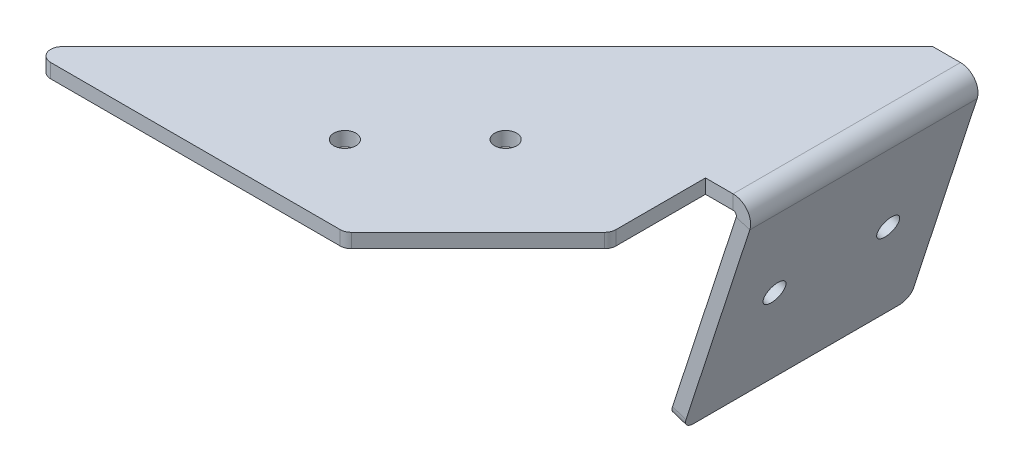
ISO-10303-21;
HEADER;
FILE_DESCRIPTION(('STEP AP214'),'2;1');
FILE_NAME('part.step','',(''),(''),'','','');
FILE_SCHEMA(('AUTOMOTIVE_DESIGN { 1 0 10303 214 1 1 1 1 }'));
ENDSEC;
DATA;
#1=APPLICATION_CONTEXT('core data for automotive mechanical design processes');
#2=APPLICATION_PROTOCOL_DEFINITION('international standard','automotive_design',2000,#1);
#3=PRODUCT_CONTEXT('',#1,'mechanical');
#4=PRODUCT('Part','Part','',(#3));
#5=PRODUCT_RELATED_PRODUCT_CATEGORY('part','',(#4));
#6=PRODUCT_DEFINITION_FORMATION('','',#4);
#7=PRODUCT_DEFINITION_CONTEXT('part definition',#1,'design');
#8=PRODUCT_DEFINITION('design','',#6,#7);
#9=PRODUCT_DEFINITION_SHAPE('','',#8);
#10=(LENGTH_UNIT() NAMED_UNIT(*) SI_UNIT(.MILLI.,.METRE.));
#11=(NAMED_UNIT(*) PLANE_ANGLE_UNIT() SI_UNIT($,.RADIAN.));
#12=(NAMED_UNIT(*) SI_UNIT($,.STERADIAN.) SOLID_ANGLE_UNIT());
#13=UNCERTAINTY_MEASURE_WITH_UNIT(LENGTH_MEASURE(1.E-05),#10,'distance_accuracy_value','');
#14=(GEOMETRIC_REPRESENTATION_CONTEXT(3) GLOBAL_UNCERTAINTY_ASSIGNED_CONTEXT((#13)) GLOBAL_UNIT_ASSIGNED_CONTEXT((#10,
#11,#12)) REPRESENTATION_CONTEXT('',''));
#15=CARTESIAN_POINT('',(0.,0.,0.));
#16=DIRECTION('',(0.,0.,1.));
#17=DIRECTION('',(1.,0.,0.));
#18=AXIS2_PLACEMENT_3D('',#15,#16,#17);
#19=CARTESIAN_POINT('',(-19.4523582685004,5.89158318623824,-25.4));
#20=DIRECTION('',(0.,0.,-1.));
#21=DIRECTION('',(0.309016994374951,0.951056516295152,0.));
#22=AXIS2_PLACEMENT_3D('',#19,#20,#21);
#23=PLANE('',#22);
#24=DIRECTION('',(0.309016994374951,0.951056516295152,0.));
#25=VECTOR('',#24,1.);
#26=CARTESIAN_POINT('',(-19.4523582685004,5.89158318623824,-25.4));
#27=LINE('',#26,#25);
#28=CARTESIAN_POINT('',(-36.9478498322293,-47.9540031742379,-25.4));
#29=VERTEX_POINT('',#28);
#30=CARTESIAN_POINT('',(-22.7115644159594,-4.13922191805659,-25.4));
#31=VERTEX_POINT('',#30);
#32=EDGE_CURVE('E195',#29,#31,#27,.T.);
#33=ORIENTED_EDGE('',*,*,#32,.T.);
#34=DIRECTION('',(0.951056516295152,-0.309016994374951,0.));
#35=VECTOR('',#34,1.);
#36=CARTESIAN_POINT('',(-22.7115644159594,-4.13922191805659,-25.4));
#37=LINE('',#36,#35);
#38=CARTESIAN_POINT('',(-19.6919599767223,-5.12035087519706,-25.4));
#39=VERTEX_POINT('',#38);
#40=EDGE_CURVE('E12',#31,#39,#37,.T.);
#41=ORIENTED_EDGE('',*,*,#40,.T.);
#42=DIRECTION('',(0.309016994374951,0.951056516295152,0.));
#43=VECTOR('',#42,1.);
#44=CARTESIAN_POINT('',(-16.4327538292633,4.91045422909777,-25.4));
#45=LINE('',#44,#43);
#46=CARTESIAN_POINT('',(-33.9282453929921,-48.9351321313783,-25.4));
#47=VERTEX_POINT('',#46);
#48=EDGE_CURVE('E186',#47,#39,#45,.T.);
#49=ORIENTED_EDGE('',*,*,#48,.F.);
#50=DIRECTION('',(0.951056516295152,-0.309016994374951,0.));
#51=VECTOR('',#50,1.);
#52=CARTESIAN_POINT('',(-36.9478498322293,-47.9540031742379,-25.4));
#53=LINE('',#52,#51);
#54=EDGE_CURVE('E67',#29,#47,#53,.T.);
#55=ORIENTED_EDGE('',*,*,#54,.F.);
#56=EDGE_LOOP('',(#33,#41,#49,#55));
#57=FACE_BOUND('',#56,.T.);
#58=ADVANCED_FACE('F42',(#57),#23,.T.);
#59=CARTESIAN_POINT('',(-19.4523582685004,5.89158318623824,25.4));
#60=DIRECTION('',(0.,0.,1.));
#61=DIRECTION('',(-0.309016994374951,-0.951056516295152,0.));
#62=AXIS2_PLACEMENT_3D('',#59,#60,#61);
#63=PLANE('',#62);
#64=DIRECTION('',(-0.309016994374951,-0.951056516295152,0.));
#65=VECTOR('',#64,1.);
#66=CARTESIAN_POINT('',(-16.4327538292633,4.91045422909777,25.4));
#67=LINE('',#66,#65);
#68=CARTESIAN_POINT('',(-19.6919599767223,-5.12035087519706,25.4));
#69=VERTEX_POINT('',#68);
#70=CARTESIAN_POINT('',(-33.9282453929921,-48.9351321313783,25.4));
#71=VERTEX_POINT('',#70);
#72=EDGE_CURVE('E189',#69,#71,#67,.T.);
#73=ORIENTED_EDGE('',*,*,#72,.F.);
#74=DIRECTION('',(-0.951056516295152,0.309016994374951,0.));
#75=VECTOR('',#74,1.);
#76=CARTESIAN_POINT('',(-22.7115644159594,-4.13922191805659,25.4));
#77=LINE('',#76,#75);
#78=CARTESIAN_POINT('',(-22.7115644159594,-4.13922191805659,25.4));
#79=VERTEX_POINT('',#78);
#80=EDGE_CURVE('E170',#69,#79,#77,.T.);
#81=ORIENTED_EDGE('',*,*,#80,.T.);
#82=DIRECTION('',(-0.309016994374951,-0.951056516295152,0.));
#83=VECTOR('',#82,1.);
#84=CARTESIAN_POINT('',(-19.4523582685004,5.89158318623824,25.4));
#85=LINE('',#84,#83);
#86=CARTESIAN_POINT('',(-36.9478498322293,-47.9540031742379,25.4));
#87=VERTEX_POINT('',#86);
#88=EDGE_CURVE('E45',#79,#87,#85,.T.);
#89=ORIENTED_EDGE('',*,*,#88,.T.);
#90=DIRECTION('',(0.951056516295152,-0.309016994374951,0.));
#91=VECTOR('',#90,1.);
#92=CARTESIAN_POINT('',(-36.9478498322293,-47.9540031742379,25.4));
#93=LINE('',#92,#91);
#94=EDGE_CURVE('E197',#87,#71,#93,.T.);
#95=ORIENTED_EDGE('',*,*,#94,.T.);
#96=EDGE_LOOP('',(#73,#81,#89,#95));
#97=FACE_BOUND('',#96,.T.);
#98=ADVANCED_FACE('F188',(#97),#63,.T.);
#99=CARTESIAN_POINT('',(-18.667455102788,8.30726673762793,45.389946520126));
#100=DIRECTION('',(-0.951056516295152,0.309016994374951,0.));
#101=DIRECTION('',(0.,0.,-1.));
#102=AXIS2_PLACEMENT_3D('',#99,#100,#101);
#103=PLANE('',#102);
#104=CARTESIAN_POINT('',(-29.8837213408179,-26.2128512117307,12.7));
#105=DIRECTION('',(0.951056516295152,-0.309016994374951,0.));
#106=DIRECTION('',(0.,0.,1.));
#107=AXIS2_PLACEMENT_3D('',#104,#105,#106);
#108=CIRCLE('',#107,2.4638);
#109=CARTESIAN_POINT('',(-29.8837213408179,-26.2128512117307,15.1638));
#110=VERTEX_POINT('',#109);
#111=EDGE_CURVE('E202',#110,#110,#108,.T.);
#112=ORIENTED_EDGE('',*,*,#111,.T.);
#113=EDGE_LOOP('',(#112));
#114=FACE_BOUND('',#113,.T.);
#115=CARTESIAN_POINT('',(-29.8837213408179,-26.2128512117307,-12.7));
#116=DIRECTION('',(0.951056516295152,-0.309016994374951,0.));
#117=DIRECTION('',(0.,0.,1.));
#118=AXIS2_PLACEMENT_3D('',#115,#116,#117);
#119=CIRCLE('',#118,2.4638);
#120=CARTESIAN_POINT('',(-29.8837213408179,-26.2128512117307,-10.2362));
#121=VERTEX_POINT('',#120);
#122=EDGE_CURVE('E213',#121,#121,#119,.T.);
#123=ORIENTED_EDGE('',*,*,#122,.T.);
#124=EDGE_LOOP('',(#123));
#125=FACE_BOUND('',#124,.T.);
#126=ORIENTED_EDGE('',*,*,#88,.F.);
#127=DIRECTION('',(0.,0.,-1.));
#128=VECTOR('',#127,1.);
#129=CARTESIAN_POINT('',(-22.7115644159594,-4.13922191805659,45.389946520126));
#130=LINE('',#129,#128);
#131=EDGE_CURVE('E165',#79,#31,#130,.T.);
#132=ORIENTED_EDGE('',*,*,#131,.T.);
#133=ORIENTED_EDGE('',*,*,#32,.F.);
#134=CARTESIAN_POINT('',(-36.9478498322293,-47.9540031742379,-22.86));
#135=DIRECTION('',(0.951056516295152,-0.309016994374951,0.));
#136=DIRECTION('',(0.,0.,-1.));
#137=AXIS2_PLACEMENT_3D('',#134,#135,#136);
#138=CIRCLE('',#137,2.54);
#139=CARTESIAN_POINT('',(-37.7327529979416,-50.3696867256276,-22.86));
#140=VERTEX_POINT('',#139);
#141=EDGE_CURVE('E198',#140,#29,#138,.T.);
#142=ORIENTED_EDGE('',*,*,#141,.F.);
#143=DIRECTION('',(0.,0.,-1.));
#144=VECTOR('',#143,1.);
#145=CARTESIAN_POINT('',(-37.7327529979416,-50.3696867256276,22.86));
#146=LINE('',#145,#144);
#147=CARTESIAN_POINT('',(-37.7327529979416,-50.3696867256276,22.86));
#148=VERTEX_POINT('',#147);
#149=EDGE_CURVE('E220',#148,#140,#146,.T.);
#150=ORIENTED_EDGE('',*,*,#149,.F.);
#151=CARTESIAN_POINT('',(-36.9478498322293,-47.9540031742379,22.86));
#152=DIRECTION('',(0.951056516295152,-0.309016994374951,0.));
#153=DIRECTION('',(0.,0.,1.));
#154=AXIS2_PLACEMENT_3D('',#151,#152,#153);
#155=CIRCLE('',#154,2.54);
#156=EDGE_CURVE('E185',#87,#148,#155,.T.);
#157=ORIENTED_EDGE('',*,*,#156,.F.);
#158=EDGE_LOOP('',(#126,#132,#133,#142,#150,#157));
#159=FACE_BOUND('',#158,.T.);
#160=ADVANCED_FACE('F182',(#114,#125,#159),#103,.T.);
#161=CARTESIAN_POINT('',(-36.9478498322293,-47.9540031742379,-22.86));
#162=DIRECTION('',(0.951056516295152,-0.309016994374951,0.));
#163=DIRECTION('',(0.,0.,1.));
#164=AXIS2_PLACEMENT_3D('',#161,#162,#163);
#165=CYLINDRICAL_SURFACE('',#164,2.54);
#166=CARTESIAN_POINT('',(-33.9282453929921,-48.9351321313783,-22.86));
#167=DIRECTION('',(0.951056516295152,-0.309016994374951,0.));
#168=DIRECTION('',(0.,0.,-1.));
#169=AXIS2_PLACEMENT_3D('',#166,#167,#168);
#170=CIRCLE('',#169,2.54);
#171=CARTESIAN_POINT('',(-34.7131485587045,-51.350815682768,-22.86));
#172=VERTEX_POINT('',#171);
#173=EDGE_CURVE('E200',#172,#47,#170,.T.);
#174=ORIENTED_EDGE('',*,*,#173,.F.);
#175=DIRECTION('',(0.951056516295152,-0.309016994374951,0.));
#176=VECTOR('',#175,1.);
#177=CARTESIAN_POINT('',(-37.7327529979416,-50.3696867256276,-22.86));
#178=LINE('',#177,#176);
#179=EDGE_CURVE('E229',#140,#172,#178,.T.);
#180=ORIENTED_EDGE('',*,*,#179,.F.);
#181=ORIENTED_EDGE('',*,*,#141,.T.);
#182=ORIENTED_EDGE('',*,*,#54,.T.);
#183=EDGE_LOOP('',(#174,#180,#181,#182));
#184=FACE_BOUND('',#183,.T.);
#185=ADVANCED_FACE('F241',(#184),#165,.T.);
#186=CARTESIAN_POINT('',(-37.7327529979416,-50.3696867256276,22.86));
#187=DIRECTION('',(-0.309016994374951,-0.951056516295152,0.));
#188=DIRECTION('',(0.,0.,-1.));
#189=AXIS2_PLACEMENT_3D('',#186,#187,#188);
#190=PLANE('',#189);
#191=DIRECTION('',(0.,0.,-1.));
#192=VECTOR('',#191,1.);
#193=CARTESIAN_POINT('',(-34.7131485587045,-51.350815682768,22.86));
#194=LINE('',#193,#192);
#195=CARTESIAN_POINT('',(-34.7131485587045,-51.350815682768,22.86));
#196=VERTEX_POINT('',#195);
#197=EDGE_CURVE('E205',#196,#172,#194,.T.);
#198=ORIENTED_EDGE('',*,*,#197,.F.);
#199=DIRECTION('',(0.951056516295152,-0.309016994374951,0.));
#200=VECTOR('',#199,1.);
#201=CARTESIAN_POINT('',(-37.7327529979416,-50.3696867256276,22.86));
#202=LINE('',#201,#200);
#203=EDGE_CURVE('E231',#148,#196,#202,.T.);
#204=ORIENTED_EDGE('',*,*,#203,.F.);
#205=ORIENTED_EDGE('',*,*,#149,.T.);
#206=ORIENTED_EDGE('',*,*,#179,.T.);
#207=EDGE_LOOP('',(#198,#204,#205,#206));
#208=FACE_BOUND('',#207,.T.);
#209=ADVANCED_FACE('F239',(#208),#190,.T.);
#210=CARTESIAN_POINT('',(-36.9478498322293,-47.9540031742379,22.86));
#211=DIRECTION('',(0.951056516295152,-0.309016994374951,0.));
#212=DIRECTION('',(0.,0.,1.));
#213=AXIS2_PLACEMENT_3D('',#210,#211,#212);
#214=CYLINDRICAL_SURFACE('',#213,2.54);
#215=CARTESIAN_POINT('',(-33.9282453929921,-48.9351321313783,22.86));
#216=DIRECTION('',(0.951056516295152,-0.309016994374951,0.));
#217=DIRECTION('',(0.,0.,1.));
#218=AXIS2_PLACEMENT_3D('',#215,#216,#217);
#219=CIRCLE('',#218,2.54);
#220=EDGE_CURVE('E201',#71,#196,#219,.T.);
#221=ORIENTED_EDGE('',*,*,#220,.F.);
#222=ORIENTED_EDGE('',*,*,#94,.F.);
#223=ORIENTED_EDGE('',*,*,#156,.T.);
#224=ORIENTED_EDGE('',*,*,#203,.T.);
#225=EDGE_LOOP('',(#221,#222,#223,#224));
#226=FACE_BOUND('',#225,.T.);
#227=ADVANCED_FACE('F234',(#226),#214,.T.);
#228=CARTESIAN_POINT('',(-15.6478506635509,7.32613778048745,45.389946520126));
#229=DIRECTION('',(-0.951056516295152,0.309016994374951,0.));
#230=DIRECTION('',(0.,0.,-1.));
#231=AXIS2_PLACEMENT_3D('',#228,#229,#230);
#232=PLANE('',#231);
#233=DIRECTION('',(0.,0.,-1.));
#234=VECTOR('',#233,1.);
#235=CARTESIAN_POINT('',(-19.6919599767223,-5.12035087519706,45.389946520126));
#236=LINE('',#235,#234);
#237=EDGE_CURVE('E50',#69,#39,#236,.T.);
#238=ORIENTED_EDGE('',*,*,#237,.F.);
#239=ORIENTED_EDGE('',*,*,#72,.T.);
#240=ORIENTED_EDGE('',*,*,#220,.T.);
#241=ORIENTED_EDGE('',*,*,#197,.T.);
#242=ORIENTED_EDGE('',*,*,#173,.T.);
#243=ORIENTED_EDGE('',*,*,#48,.T.);
#244=EDGE_LOOP('',(#238,#239,#240,#241,#242,#243));
#245=FACE_BOUND('',#244,.T.);
#246=CARTESIAN_POINT('',(-26.8641169015808,-27.1939801688712,-12.7));
#247=DIRECTION('',(0.951056516295152,-0.309016994374951,0.));
#248=DIRECTION('',(0.,0.,1.));
#249=AXIS2_PLACEMENT_3D('',#246,#247,#248);
#250=CIRCLE('',#249,2.4638);
#251=CARTESIAN_POINT('',(-26.8641169015808,-27.1939801688712,-10.2362));
#252=VERTEX_POINT('',#251);
#253=EDGE_CURVE('E216',#252,#252,#250,.T.);
#254=ORIENTED_EDGE('',*,*,#253,.F.);
#255=EDGE_LOOP('',(#254));
#256=FACE_BOUND('',#255,.T.);
#257=CARTESIAN_POINT('',(-26.8641169015808,-27.1939801688712,12.7));
#258=DIRECTION('',(0.951056516295152,-0.309016994374951,0.));
#259=DIRECTION('',(0.,0.,1.));
#260=AXIS2_PLACEMENT_3D('',#257,#258,#259);
#261=CIRCLE('',#260,2.4638);
#262=CARTESIAN_POINT('',(-26.8641169015808,-27.1939801688712,15.1638));
#263=VERTEX_POINT('',#262);
#264=EDGE_CURVE('E208',#263,#263,#261,.T.);
#265=ORIENTED_EDGE('',*,*,#264,.F.);
#266=EDGE_LOOP('',(#265));
#267=FACE_BOUND('',#266,.T.);
#268=ADVANCED_FACE('F236',(#245,#256,#267),#232,.F.);
#269=CARTESIAN_POINT('',(-29.8837213408179,-26.2128512117307,12.7));
#270=DIRECTION('',(0.951056516295152,-0.309016994374951,0.));
#271=DIRECTION('',(0.,0.,1.));
#272=AXIS2_PLACEMENT_3D('',#269,#270,#271);
#273=CYLINDRICAL_SURFACE('',#272,2.4638);
#274=ORIENTED_EDGE('',*,*,#111,.F.);
#275=EDGE_LOOP('',(#274));
#276=FACE_BOUND('',#275,.T.);
#277=ORIENTED_EDGE('',*,*,#264,.T.);
#278=EDGE_LOOP('',(#277));
#279=FACE_BOUND('',#278,.T.);
#280=ADVANCED_FACE('F365',(#276,#279),#273,.F.);
#281=CARTESIAN_POINT('',(-29.8837213408179,-26.2128512117307,-12.7));
#282=DIRECTION('',(0.951056516295152,-0.309016994374951,0.));
#283=DIRECTION('',(0.,0.,1.));
#284=AXIS2_PLACEMENT_3D('',#281,#282,#283);
#285=CYLINDRICAL_SURFACE('',#284,2.4638);
#286=ORIENTED_EDGE('',*,*,#122,.F.);
#287=EDGE_LOOP('',(#286));
#288=FACE_BOUND('',#287,.T.);
#289=ORIENTED_EDGE('',*,*,#253,.T.);
#290=EDGE_LOOP('',(#289));
#291=FACE_BOUND('',#290,.T.);
#292=ADVANCED_FACE('F362',(#288,#291),#285,.F.);
#293=CARTESIAN_POINT('',(-77.2967632735843,-3.175,58.2394877578618));
#294=DIRECTION('',(0.,1.,0.));
#295=DIRECTION('',(0.,0.,1.));
#296=AXIS2_PLACEMENT_3D('',#293,#294,#295);
#297=CYLINDRICAL_SURFACE('',#296,2.46380000000002);
#298=CARTESIAN_POINT('',(-77.2967632735843,-3.175,58.2394877578618));
#299=DIRECTION('',(0.,1.,0.));
#300=DIRECTION('',(0.,0.,1.));
#301=AXIS2_PLACEMENT_3D('',#298,#299,#300);
#302=CIRCLE('',#301,2.46380000000002);
#303=CARTESIAN_POINT('',(-77.2967632735843,-3.175,60.7032877578618));
#304=VERTEX_POINT('',#303);
#305=EDGE_CURVE('E306',#304,#304,#302,.T.);
#306=ORIENTED_EDGE('',*,*,#305,.F.);
#307=EDGE_LOOP('',(#306));
#308=FACE_BOUND('',#307,.T.);
#309=CARTESIAN_POINT('',(-77.2967632735843,0.,58.2394877578618));
#310=DIRECTION('',(0.,1.,0.));
#311=DIRECTION('',(0.,0.,1.));
#312=AXIS2_PLACEMENT_3D('',#309,#310,#311);
#313=CIRCLE('',#312,2.46380000000002);
#314=CARTESIAN_POINT('',(-77.2967632735843,0.,60.7032877578618));
#315=VERTEX_POINT('',#314);
#316=EDGE_CURVE('E350',#315,#315,#313,.T.);
#317=ORIENTED_EDGE('',*,*,#316,.T.);
#318=EDGE_LOOP('',(#317));
#319=FACE_BOUND('',#318,.T.);
#320=ADVANCED_FACE('F373',(#308,#319),#297,.F.);
#321=CARTESIAN_POINT('',(-59.3362510314459,-3.175,40.2789755157236));
#322=DIRECTION('',(0.,1.,0.));
#323=DIRECTION('',(0.,0.,1.));
#324=AXIS2_PLACEMENT_3D('',#321,#322,#323);
#325=CYLINDRICAL_SURFACE('',#324,2.46380000000001);
#326=CARTESIAN_POINT('',(-59.3362510314459,-3.175,40.2789755157236));
#327=DIRECTION('',(0.,1.,0.));
#328=DIRECTION('',(0.,0.,1.));
#329=AXIS2_PLACEMENT_3D('',#326,#327,#328);
#330=CIRCLE('',#329,2.46380000000001);
#331=CARTESIAN_POINT('',(-59.3362510314459,-3.175,42.7427755157236));
#332=VERTEX_POINT('',#331);
#333=EDGE_CURVE('E309',#332,#332,#330,.T.);
#334=ORIENTED_EDGE('',*,*,#333,.F.);
#335=EDGE_LOOP('',(#334));
#336=FACE_BOUND('',#335,.T.);
#337=CARTESIAN_POINT('',(-59.3362510314459,0.,40.2789755157236));
#338=DIRECTION('',(0.,1.,0.));
#339=DIRECTION('',(0.,0.,1.));
#340=AXIS2_PLACEMENT_3D('',#337,#338,#339);
#341=CIRCLE('',#340,2.46380000000001);
#342=CARTESIAN_POINT('',(-59.3362510314459,0.,42.7427755157236));
#343=VERTEX_POINT('',#342);
#344=EDGE_CURVE('E347',#343,#343,#341,.T.);
#345=ORIENTED_EDGE('',*,*,#344,.T.);
#346=EDGE_LOOP('',(#345));
#347=FACE_BOUND('',#346,.T.);
#348=ADVANCED_FACE('F420',(#336,#347),#325,.F.);
#349=CARTESIAN_POINT('',(-29.5783,-3.175,-25.4));
#350=DIRECTION('',(-0.707106781186552,0.,-0.707106781186544));
#351=DIRECTION('',(-0.707106781186544,0.,0.707106781186552));
#352=AXIS2_PLACEMENT_3D('',#349,#350,#351);
#353=PLANE('',#352);
#354=DIRECTION('',(-0.707106781186544,0.,0.707106781186552));
#355=VECTOR('',#354,1.);
#356=CARTESIAN_POINT('',(-29.5783,0.,-25.4));
#357=LINE('',#356,#355);
#358=CARTESIAN_POINT('',(-29.5783,0.,-25.4));
#359=VERTEX_POINT('',#358);
#360=CARTESIAN_POINT('',(-126.842248775785,0.,71.8639487757862));
#361=VERTEX_POINT('',#360);
#362=EDGE_CURVE('E296',#359,#361,#357,.T.);
#363=ORIENTED_EDGE('',*,*,#362,.F.);
#364=DIRECTION('',(0.,1.,0.));
#365=VECTOR('',#364,1.);
#366=CARTESIAN_POINT('',(-29.5783,-3.175,-25.4));
#367=LINE('',#366,#365);
#368=CARTESIAN_POINT('',(-29.5783,-3.175,-25.4));
#369=VERTEX_POINT('',#368);
#370=EDGE_CURVE('E273',#369,#359,#367,.T.);
#371=ORIENTED_EDGE('',*,*,#370,.F.);
#372=DIRECTION('',(-0.707106781186544,0.,0.707106781186552));
#373=VECTOR('',#372,1.);
#374=CARTESIAN_POINT('',(-29.5783,-3.175,-25.4));
#375=LINE('',#374,#373);
#376=CARTESIAN_POINT('',(-126.842248775785,-3.175,71.8639487757862));
#377=VERTEX_POINT('',#376);
#378=EDGE_CURVE('E344',#369,#377,#375,.T.);
#379=ORIENTED_EDGE('',*,*,#378,.T.);
#380=DIRECTION('',(0.,1.,0.));
#381=VECTOR('',#380,1.);
#382=CARTESIAN_POINT('',(-126.842248775785,-3.175,71.8639487757862));
#383=LINE('',#382,#381);
#384=EDGE_CURVE('E342',#377,#361,#383,.T.);
#385=ORIENTED_EDGE('',*,*,#384,.T.);
#386=EDGE_LOOP('',(#363,#371,#379,#385));
#387=FACE_BOUND('',#386,.T.);
#388=ADVANCED_FACE('F416',(#387),#353,.T.);
#389=CARTESIAN_POINT('',(-125.046197551571,-3.175,73.66));
#390=DIRECTION('',(0.,1.,0.));
#391=DIRECTION('',(0.,0.,1.));
#392=AXIS2_PLACEMENT_3D('',#389,#390,#391);
#393=CYLINDRICAL_SURFACE('',#392,2.54);
#394=CARTESIAN_POINT('',(-125.046197551571,0.,73.66));
#395=DIRECTION('',(0.,1.,0.));
#396=DIRECTION('',(0.,0.,1.));
#397=AXIS2_PLACEMENT_3D('',#394,#395,#396);
#398=CIRCLE('',#397,2.54);
#399=CARTESIAN_POINT('',(-125.046197551571,0.,76.2));
#400=VERTEX_POINT('',#399);
#401=EDGE_CURVE('E293',#361,#400,#398,.T.);
#402=ORIENTED_EDGE('',*,*,#401,.F.);
#403=ORIENTED_EDGE('',*,*,#384,.F.);
#404=CARTESIAN_POINT('',(-125.046197551571,-3.175,73.66));
#405=DIRECTION('',(0.,1.,0.));
#406=DIRECTION('',(0.,0.,1.));
#407=AXIS2_PLACEMENT_3D('',#404,#405,#406);
#408=CIRCLE('',#407,2.54);
#409=CARTESIAN_POINT('',(-125.046197551571,-3.175,76.2));
#410=VERTEX_POINT('',#409);
#411=EDGE_CURVE('E339',#377,#410,#408,.T.);
#412=ORIENTED_EDGE('',*,*,#411,.T.);
#413=DIRECTION('',(0.,1.,0.));
#414=VECTOR('',#413,1.);
#415=CARTESIAN_POINT('',(-125.046197551571,-3.175,76.2));
#416=LINE('',#415,#414);
#417=EDGE_CURVE('E337',#410,#400,#416,.T.);
#418=ORIENTED_EDGE('',*,*,#417,.T.);
#419=EDGE_LOOP('',(#402,#403,#412,#418));
#420=FACE_BOUND('',#419,.T.);
#421=ADVANCED_FACE('F412',(#420),#393,.T.);
#422=CARTESIAN_POINT('',(-125.046197551571,-3.175,76.2));
#423=DIRECTION('',(0.,0.,1.));
#424=DIRECTION('',(1.,0.,0.));
#425=AXIS2_PLACEMENT_3D('',#422,#423,#424);
#426=PLANE('',#425);
#427=DIRECTION('',(1.,0.,0.));
#428=VECTOR('',#427,1.);
#429=CARTESIAN_POINT('',(-125.046197551571,0.,76.2));
#430=LINE('',#429,#428);
#431=CARTESIAN_POINT('',(-60.3883534798737,0.,76.2));
#432=VERTEX_POINT('',#431);
#433=EDGE_CURVE('E290',#400,#432,#430,.T.);
#434=ORIENTED_EDGE('',*,*,#433,.F.);
#435=ORIENTED_EDGE('',*,*,#417,.F.);
#436=DIRECTION('',(1.,0.,0.));
#437=VECTOR('',#436,1.);
#438=CARTESIAN_POINT('',(-125.046197551571,-3.175,76.2));
#439=LINE('',#438,#437);
#440=CARTESIAN_POINT('',(-60.3883534798737,-3.175,76.2));
#441=VERTEX_POINT('',#440);
#442=EDGE_CURVE('E334',#410,#441,#439,.T.);
#443=ORIENTED_EDGE('',*,*,#442,.T.);
#444=DIRECTION('',(0.,1.,0.));
#445=VECTOR('',#444,1.);
#446=CARTESIAN_POINT('',(-60.3883534798737,-3.175,76.2));
#447=LINE('',#446,#445);
#448=EDGE_CURVE('E332',#441,#432,#447,.T.);
#449=ORIENTED_EDGE('',*,*,#448,.T.);
#450=EDGE_LOOP('',(#434,#435,#443,#449));
#451=FACE_BOUND('',#450,.T.);
#452=ADVANCED_FACE('F408',(#451),#426,.T.);
#453=CARTESIAN_POINT('',(-60.3883534798737,-3.175,73.66));
#454=DIRECTION('',(0.,1.,0.));
#455=DIRECTION('',(0.,0.,1.));
#456=AXIS2_PLACEMENT_3D('',#453,#454,#455);
#457=CYLINDRICAL_SURFACE('',#456,2.53999999999999);
#458=CARTESIAN_POINT('',(-60.3883534798737,0.,73.66));
#459=DIRECTION('',(0.,1.,0.));
#460=DIRECTION('',(0.,0.,1.));
#461=AXIS2_PLACEMENT_3D('',#458,#459,#460);
#462=CIRCLE('',#461,2.53999999999999);
#463=CARTESIAN_POINT('',(-58.5923022556598,0.,75.4560512242138));
#464=VERTEX_POINT('',#463);
#465=EDGE_CURVE('E287',#432,#464,#462,.T.);
#466=ORIENTED_EDGE('',*,*,#465,.F.);
#467=ORIENTED_EDGE('',*,*,#448,.F.);
#468=CARTESIAN_POINT('',(-60.3883534798737,-3.175,73.66));
#469=DIRECTION('',(0.,1.,0.));
#470=DIRECTION('',(0.,0.,1.));
#471=AXIS2_PLACEMENT_3D('',#468,#469,#470);
#472=CIRCLE('',#471,2.53999999999999);
#473=CARTESIAN_POINT('',(-58.5923022556598,-3.175,75.4560512242138));
#474=VERTEX_POINT('',#473);
#475=EDGE_CURVE('E329',#441,#474,#472,.T.);
#476=ORIENTED_EDGE('',*,*,#475,.T.);
#477=DIRECTION('',(0.,1.,0.));
#478=VECTOR('',#477,1.);
#479=CARTESIAN_POINT('',(-58.5923022556598,-3.175,75.4560512242138));
#480=LINE('',#479,#478);
#481=EDGE_CURVE('E327',#474,#464,#480,.T.);
#482=ORIENTED_EDGE('',*,*,#481,.T.);
#483=EDGE_LOOP('',(#466,#467,#476,#482));
#484=FACE_BOUND('',#483,.T.);
#485=ADVANCED_FACE('F404',(#484),#457,.T.);
#486=CARTESIAN_POINT('',(-30.3222487757861,-3.175,47.1859977443398));
#487=DIRECTION('',(0.707106781186551,0.,0.707106781186543));
#488=DIRECTION('',(0.707106781186544,0.,-0.707106781186551));
#489=AXIS2_PLACEMENT_3D('',#486,#487,#488);
#490=PLANE('',#489);
#491=DIRECTION('',(0.707106781186544,0.,-0.707106781186551));
#492=VECTOR('',#491,1.);
#493=CARTESIAN_POINT('',(-30.3222487757861,0.,47.1859977443398));
#494=LINE('',#493,#492);
#495=CARTESIAN_POINT('',(-30.3222487757861,0.,47.1859977443398));
#496=VERTEX_POINT('',#495);
#497=EDGE_CURVE('E284',#464,#496,#494,.T.);
#498=ORIENTED_EDGE('',*,*,#497,.F.);
#499=ORIENTED_EDGE('',*,*,#481,.F.);
#500=DIRECTION('',(0.707106781186544,0.,-0.707106781186551));
#501=VECTOR('',#500,1.);
#502=CARTESIAN_POINT('',(-30.3222487757861,-3.175,47.1859977443398));
#503=LINE('',#502,#501);
#504=CARTESIAN_POINT('',(-30.3222487757861,-3.175,47.1859977443398));
#505=VERTEX_POINT('',#504);
#506=EDGE_CURVE('E324',#474,#505,#503,.T.);
#507=ORIENTED_EDGE('',*,*,#506,.T.);
#508=DIRECTION('',(0.,1.,0.));
#509=VECTOR('',#508,1.);
#510=CARTESIAN_POINT('',(-30.3222487757861,-3.175,47.1859977443398));
#511=LINE('',#510,#509);
#512=EDGE_CURVE('E322',#505,#496,#511,.T.);
#513=ORIENTED_EDGE('',*,*,#512,.T.);
#514=EDGE_LOOP('',(#498,#499,#507,#513));
#515=FACE_BOUND('',#514,.T.);
#516=ADVANCED_FACE('F400',(#515),#490,.T.);
#517=CARTESIAN_POINT('',(-32.1183,-3.175,45.389946520126));
#518=DIRECTION('',(0.,1.,0.));
#519=DIRECTION('',(0.,0.,1.));
#520=AXIS2_PLACEMENT_3D('',#517,#518,#519);
#521=CYLINDRICAL_SURFACE('',#520,2.54);
#522=CARTESIAN_POINT('',(-32.1183,0.,45.389946520126));
#523=DIRECTION('',(0.,1.,0.));
#524=DIRECTION('',(0.,0.,-1.));
#525=AXIS2_PLACEMENT_3D('',#522,#523,#524);
#526=CIRCLE('',#525,2.54);
#527=CARTESIAN_POINT('',(-29.5783,0.,45.389946520126));
#528=VERTEX_POINT('',#527);
#529=EDGE_CURVE('E281',#496,#528,#526,.T.);
#530=ORIENTED_EDGE('',*,*,#529,.F.);
#531=ORIENTED_EDGE('',*,*,#512,.F.);
#532=CARTESIAN_POINT('',(-32.1183,-3.175,45.389946520126));
#533=DIRECTION('',(0.,1.,0.));
#534=DIRECTION('',(0.,0.,-1.));
#535=AXIS2_PLACEMENT_3D('',#532,#533,#534);
#536=CIRCLE('',#535,2.54);
#537=CARTESIAN_POINT('',(-29.5783,-3.175,45.389946520126));
#538=VERTEX_POINT('',#537);
#539=EDGE_CURVE('E319',#505,#538,#536,.T.);
#540=ORIENTED_EDGE('',*,*,#539,.T.);
#541=DIRECTION('',(0.,1.,0.));
#542=VECTOR('',#541,1.);
#543=CARTESIAN_POINT('',(-29.5783,-3.175,45.389946520126));
#544=LINE('',#543,#542);
#545=EDGE_CURVE('E317',#538,#528,#544,.T.);
#546=ORIENTED_EDGE('',*,*,#545,.T.);
#547=EDGE_LOOP('',(#530,#531,#540,#546));
#548=FACE_BOUND('',#547,.T.);
#549=ADVANCED_FACE('F396',(#548),#521,.T.);
#550=CARTESIAN_POINT('',(-29.5783,-3.175,25.4));
#551=DIRECTION('',(1.,0.,0.));
#552=DIRECTION('',(0.,0.,-1.));
#553=AXIS2_PLACEMENT_3D('',#550,#551,#552);
#554=PLANE('',#553);
#555=DIRECTION('',(0.,0.,-1.));
#556=VECTOR('',#555,1.);
#557=CARTESIAN_POINT('',(-29.5783,0.,25.4));
#558=LINE('',#557,#556);
#559=CARTESIAN_POINT('',(-29.5783,0.,25.4));
#560=VERTEX_POINT('',#559);
#561=EDGE_CURVE('E278',#528,#560,#558,.T.);
#562=ORIENTED_EDGE('',*,*,#561,.F.);
#563=ORIENTED_EDGE('',*,*,#545,.F.);
#564=DIRECTION('',(0.,0.,-1.));
#565=VECTOR('',#564,1.);
#566=CARTESIAN_POINT('',(-29.5783,-3.175,25.4));
#567=LINE('',#566,#565);
#568=CARTESIAN_POINT('',(-29.5783,-3.175,25.4));
#569=VERTEX_POINT('',#568);
#570=EDGE_CURVE('E314',#538,#569,#567,.T.);
#571=ORIENTED_EDGE('',*,*,#570,.T.);
#572=DIRECTION('',(0.,1.,0.));
#573=VECTOR('',#572,1.);
#574=CARTESIAN_POINT('',(-29.5783,-3.175,25.4));
#575=LINE('',#574,#573);
#576=EDGE_CURVE('E312',#569,#560,#575,.T.);
#577=ORIENTED_EDGE('',*,*,#576,.T.);
#578=EDGE_LOOP('',(#562,#563,#571,#577));
#579=FACE_BOUND('',#578,.T.);
#580=ADVANCED_FACE('F392',(#579),#554,.T.);
#581=CARTESIAN_POINT('',(-32.1183,-3.175,45.389946520126));
#582=DIRECTION('',(0.,-1.,0.));
#583=DIRECTION('',(0.,0.,-1.));
#584=AXIS2_PLACEMENT_3D('',#581,#582,#583);
#585=PLANE('',#584);
#586=DIRECTION('',(0.,0.,-1.));
#587=VECTOR('',#586,1.);
#588=CARTESIAN_POINT('',(-23.4121126458624,-3.175,45.389946520126));
#589=LINE('',#588,#587);
#590=CARTESIAN_POINT('',(-23.4121126458624,-3.175,25.4));
#591=VERTEX_POINT('',#590);
#592=CARTESIAN_POINT('',(-23.4121126458624,-3.175,-25.4));
#593=VERTEX_POINT('',#592);
#594=EDGE_CURVE('E355',#591,#593,#589,.T.);
#595=ORIENTED_EDGE('',*,*,#594,.F.);
#596=DIRECTION('',(1.,0.,0.));
#597=VECTOR('',#596,1.);
#598=CARTESIAN_POINT('',(-29.5783,-3.175,25.4));
#599=LINE('',#598,#597);
#600=EDGE_CURVE('E304',#569,#591,#599,.T.);
#601=ORIENTED_EDGE('',*,*,#600,.F.);
#602=ORIENTED_EDGE('',*,*,#570,.F.);
#603=ORIENTED_EDGE('',*,*,#539,.F.);
#604=ORIENTED_EDGE('',*,*,#506,.F.);
#605=ORIENTED_EDGE('',*,*,#475,.F.);
#606=ORIENTED_EDGE('',*,*,#442,.F.);
#607=ORIENTED_EDGE('',*,*,#411,.F.);
#608=ORIENTED_EDGE('',*,*,#378,.F.);
#609=DIRECTION('',(-1.,0.,0.));
#610=VECTOR('',#609,1.);
#611=CARTESIAN_POINT('',(-29.5783,-3.175,-25.4));
#612=LINE('',#611,#610);
#613=EDGE_CURVE('E276',#593,#369,#612,.T.);
#614=ORIENTED_EDGE('',*,*,#613,.F.);
#615=EDGE_LOOP('',(#595,#601,#602,#603,#604,#605,#606,#607,#608,#614));
#616=FACE_BOUND('',#615,.T.);
#617=ORIENTED_EDGE('',*,*,#333,.T.);
#618=EDGE_LOOP('',(#617));
#619=FACE_BOUND('',#618,.T.);
#620=ORIENTED_EDGE('',*,*,#305,.T.);
#621=EDGE_LOOP('',(#620));
#622=FACE_BOUND('',#621,.T.);
#623=ADVANCED_FACE('F388',(#616,#619,#622),#585,.T.);
#624=CARTESIAN_POINT('',(-29.5783,-3.175,25.4));
#625=DIRECTION('',(0.,0.,1.));
#626=DIRECTION('',(1.,0.,0.));
#627=AXIS2_PLACEMENT_3D('',#624,#625,#626);
#628=PLANE('',#627);
#629=DIRECTION('',(0.,-1.,0.));
#630=VECTOR('',#629,1.);
#631=CARTESIAN_POINT('',(-23.4121126458624,-3.175,25.4));
#632=LINE('',#631,#630);
#633=CARTESIAN_POINT('',(-23.4121126458624,0.,25.4));
#634=VERTEX_POINT('',#633);
#635=EDGE_CURVE('E178',#634,#591,#632,.T.);
#636=ORIENTED_EDGE('',*,*,#635,.F.);
#637=DIRECTION('',(1.,0.,0.));
#638=VECTOR('',#637,1.);
#639=CARTESIAN_POINT('',(-29.5783,0.,25.4));
#640=LINE('',#639,#638);
#641=EDGE_CURVE('E302',#560,#634,#640,.T.);
#642=ORIENTED_EDGE('',*,*,#641,.F.);
#643=ORIENTED_EDGE('',*,*,#576,.F.);
#644=ORIENTED_EDGE('',*,*,#600,.T.);
#645=EDGE_LOOP('',(#636,#642,#643,#644));
#646=FACE_BOUND('',#645,.T.);
#647=ADVANCED_FACE('F384',(#646),#628,.T.);
#648=CARTESIAN_POINT('',(-32.1183,0.,45.389946520126));
#649=DIRECTION('',(0.,-1.,0.));
#650=DIRECTION('',(0.,0.,-1.));
#651=AXIS2_PLACEMENT_3D('',#648,#649,#650);
#652=PLANE('',#651);
#653=ORIENTED_EDGE('',*,*,#316,.F.);
#654=EDGE_LOOP('',(#653));
#655=FACE_BOUND('',#654,.T.);
#656=ORIENTED_EDGE('',*,*,#344,.F.);
#657=EDGE_LOOP('',(#656));
#658=FACE_BOUND('',#657,.T.);
#659=ORIENTED_EDGE('',*,*,#641,.T.);
#660=DIRECTION('',(0.,0.,-1.));
#661=VECTOR('',#660,1.);
#662=CARTESIAN_POINT('',(-23.4121126458624,0.,45.389946520126));
#663=LINE('',#662,#661);
#664=CARTESIAN_POINT('',(-23.4121126458624,0.,-25.4));
#665=VERTEX_POINT('',#664);
#666=EDGE_CURVE('E269',#634,#665,#663,.T.);
#667=ORIENTED_EDGE('',*,*,#666,.T.);
#668=DIRECTION('',(-1.,0.,0.));
#669=VECTOR('',#668,1.);
#670=CARTESIAN_POINT('',(-29.5783,0.,-25.4));
#671=LINE('',#670,#669);
#672=EDGE_CURVE('E299',#665,#359,#671,.T.);
#673=ORIENTED_EDGE('',*,*,#672,.T.);
#674=ORIENTED_EDGE('',*,*,#362,.T.);
#675=ORIENTED_EDGE('',*,*,#401,.T.);
#676=ORIENTED_EDGE('',*,*,#433,.T.);
#677=ORIENTED_EDGE('',*,*,#465,.T.);
#678=ORIENTED_EDGE('',*,*,#497,.T.);
#679=ORIENTED_EDGE('',*,*,#529,.T.);
#680=ORIENTED_EDGE('',*,*,#561,.T.);
#681=EDGE_LOOP('',(#659,#667,#673,#674,#675,#676,#677,#678,#679,#680));
#682=FACE_BOUND('',#681,.T.);
#683=ADVANCED_FACE('F380',(#655,#658,#682),#652,.F.);
#684=CARTESIAN_POINT('',(-29.5783,-3.175,-25.4));
#685=DIRECTION('',(0.,0.,-1.));
#686=DIRECTION('',(-1.,0.,0.));
#687=AXIS2_PLACEMENT_3D('',#684,#685,#686);
#688=PLANE('',#687);
#689=DIRECTION('',(0.,1.,0.));
#690=VECTOR('',#689,1.);
#691=CARTESIAN_POINT('',(-23.4121126458624,-3.175,-25.4));
#692=LINE('',#691,#690);
#693=EDGE_CURVE('E262',#593,#665,#692,.T.);
#694=ORIENTED_EDGE('',*,*,#693,.F.);
#695=ORIENTED_EDGE('',*,*,#613,.T.);
#696=ORIENTED_EDGE('',*,*,#370,.T.);
#697=ORIENTED_EDGE('',*,*,#672,.F.);
#698=EDGE_LOOP('',(#694,#695,#696,#697));
#699=FACE_BOUND('',#698,.T.);
#700=ADVANCED_FACE('F377',(#699),#688,.T.);
#701=CARTESIAN_POINT('',(-23.4121126458624,-3.9116,25.4));
#702=DIRECTION('',(0.,0.,-1.));
#703=DIRECTION('',(-1.,0.,0.));
#704=AXIS2_PLACEMENT_3D('',#701,#702,#703);
#705=PLANE('',#704);
#706=ORIENTED_EDGE('',*,*,#80,.F.);
#707=CARTESIAN_POINT('',(-23.4121126458624,-3.9116,25.4));
#708=DIRECTION('',(0.,0.,1.));
#709=DIRECTION('',(1.,0.,0.));
#710=AXIS2_PLACEMENT_3D('',#707,#708,#709);
#711=CIRCLE('',#710,3.9116);
#712=EDGE_CURVE('E265',#69,#634,#711,.T.);
#713=ORIENTED_EDGE('',*,*,#712,.T.);
#714=ORIENTED_EDGE('',*,*,#635,.T.);
#715=CARTESIAN_POINT('',(-23.4121126458624,-3.9116,25.4));
#716=DIRECTION('',(0.,0.,1.));
#717=DIRECTION('',(-1.,0.,0.));
#718=AXIS2_PLACEMENT_3D('',#715,#716,#717);
#719=CIRCLE('',#718,0.7366);
#720=EDGE_CURVE('E168',#79,#591,#719,.T.);
#721=ORIENTED_EDGE('',*,*,#720,.F.);
#722=EDGE_LOOP('',(#706,#713,#714,#721));
#723=FACE_BOUND('',#722,.T.);
#724=ADVANCED_FACE('F174',(#723),#705,.F.);
#725=CARTESIAN_POINT('',(-23.4121126458624,-3.9116,-25.4));
#726=DIRECTION('',(0.,0.,1.));
#727=DIRECTION('',(1.,0.,0.));
#728=AXIS2_PLACEMENT_3D('',#725,#726,#727);
#729=PLANE('',#728);
#730=CARTESIAN_POINT('',(-23.4121126458624,-3.9116,-25.4));
#731=DIRECTION('',(0.,0.,1.));
#732=DIRECTION('',(1.,0.,0.));
#733=AXIS2_PLACEMENT_3D('',#730,#731,#732);
#734=CIRCLE('',#733,3.9116);
#735=EDGE_CURVE('E179',#665,#39,#734,.F.);
#736=ORIENTED_EDGE('',*,*,#735,.T.);
#737=ORIENTED_EDGE('',*,*,#40,.F.);
#738=CARTESIAN_POINT('',(-23.4121126458624,-3.9116,-25.4));
#739=DIRECTION('',(0.,0.,-1.));
#740=DIRECTION('',(1.,0.,0.));
#741=AXIS2_PLACEMENT_3D('',#738,#739,#740);
#742=CIRCLE('',#741,0.7366);
#743=EDGE_CURVE('E58',#593,#31,#742,.T.);
#744=ORIENTED_EDGE('',*,*,#743,.F.);
#745=ORIENTED_EDGE('',*,*,#693,.T.);
#746=EDGE_LOOP('',(#736,#737,#744,#745));
#747=FACE_BOUND('',#746,.T.);
#748=ADVANCED_FACE('F258',(#747),#729,.F.);
#749=CARTESIAN_POINT('',(-23.4121126458624,-3.9116,-51.0873003322412));
#750=DIRECTION('',(0.,0.,1.));
#751=DIRECTION('',(1.,0.,0.));
#752=AXIS2_PLACEMENT_3D('',#749,#750,#751);
#753=CYLINDRICAL_SURFACE('',#752,0.7366);
#754=ORIENTED_EDGE('',*,*,#594,.T.);
#755=ORIENTED_EDGE('',*,*,#743,.T.);
#756=ORIENTED_EDGE('',*,*,#131,.F.);
#757=ORIENTED_EDGE('',*,*,#720,.T.);
#758=EDGE_LOOP('',(#754,#755,#756,#757));
#759=FACE_BOUND('',#758,.T.);
#760=ADVANCED_FACE('F167',(#759),#753,.F.);
#761=CARTESIAN_POINT('',(-23.4121126458624,-3.9116,-51.0873003322412));
#762=DIRECTION('',(0.,0.,1.));
#763=DIRECTION('',(1.,0.,0.));
#764=AXIS2_PLACEMENT_3D('',#761,#762,#763);
#765=CYLINDRICAL_SURFACE('',#764,3.9116);
#766=ORIENTED_EDGE('',*,*,#666,.F.);
#767=ORIENTED_EDGE('',*,*,#712,.F.);
#768=ORIENTED_EDGE('',*,*,#237,.T.);
#769=ORIENTED_EDGE('',*,*,#735,.F.);
#770=EDGE_LOOP('',(#766,#767,#768,#769));
#771=FACE_BOUND('',#770,.T.);
#772=ADVANCED_FACE('F267',(#771),#765,.T.);
#773=CLOSED_SHELL('',(#58,#98,#160,#185,#209,#227,#268,#280,#292,#320,#348,#388,#421,#452,#485,
#516,#549,#580,#623,#647,#683,#700,#724,#748,#760,#772));
#774=MANIFOLD_SOLID_BREP('B2',#773);
#775=ADVANCED_BREP_SHAPE_REPRESENTATION('',(#18,#774),#14);
#776=SHAPE_DEFINITION_REPRESENTATION(#9,#775);
ENDSEC;
END-ISO-10303-21;
